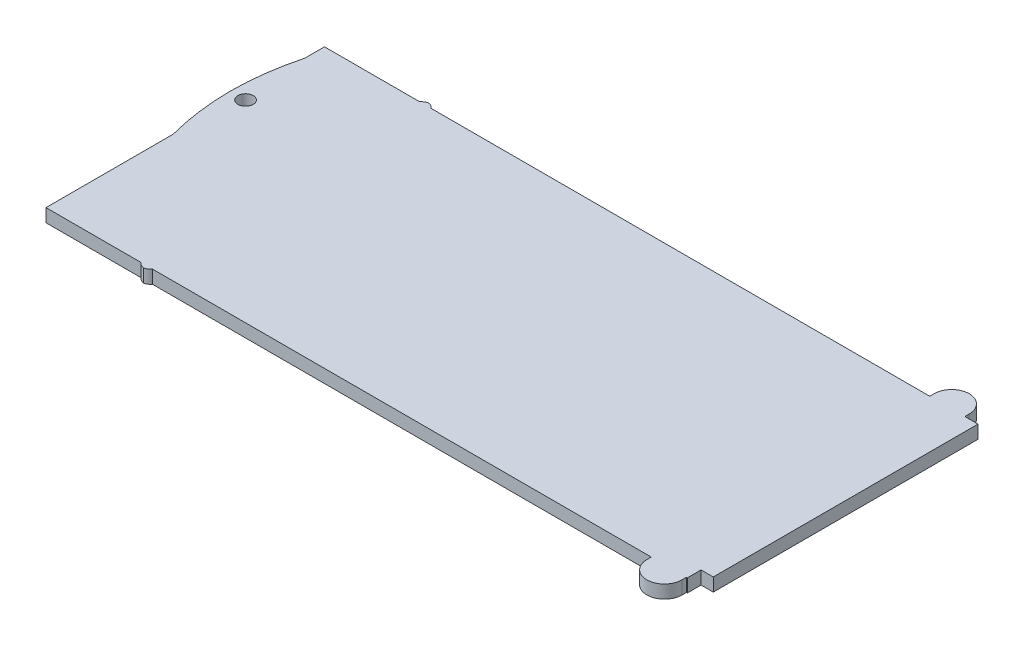
ISO-10303-21;
HEADER;
FILE_DESCRIPTION(('STEP AP214'),'2;1');
FILE_NAME('part.step','',(''),(''),'','','');
FILE_SCHEMA(('AUTOMOTIVE_DESIGN { 1 0 10303 214 1 1 1 1 }'));
ENDSEC;
DATA;
#1=APPLICATION_CONTEXT('core data for automotive mechanical design processes');
#2=APPLICATION_PROTOCOL_DEFINITION('international standard','automotive_design',2000,#1);
#3=PRODUCT_CONTEXT('',#1,'mechanical');
#4=PRODUCT('Part','Part','',(#3));
#5=PRODUCT_RELATED_PRODUCT_CATEGORY('part','',(#4));
#6=PRODUCT_DEFINITION_FORMATION('','',#4);
#7=PRODUCT_DEFINITION_CONTEXT('part definition',#1,'design');
#8=PRODUCT_DEFINITION('design','',#6,#7);
#9=PRODUCT_DEFINITION_SHAPE('','',#8);
#10=(LENGTH_UNIT() NAMED_UNIT(*) SI_UNIT(.MILLI.,.METRE.));
#11=(NAMED_UNIT(*) PLANE_ANGLE_UNIT() SI_UNIT($,.RADIAN.));
#12=(NAMED_UNIT(*) SI_UNIT($,.STERADIAN.) SOLID_ANGLE_UNIT());
#13=UNCERTAINTY_MEASURE_WITH_UNIT(LENGTH_MEASURE(1.E-05),#10,'distance_accuracy_value','');
#14=(GEOMETRIC_REPRESENTATION_CONTEXT(3) GLOBAL_UNCERTAINTY_ASSIGNED_CONTEXT((#13)) GLOBAL_UNIT_ASSIGNED_CONTEXT((#10,
#11,#12)) REPRESENTATION_CONTEXT('',''));
#15=CARTESIAN_POINT('',(0.,0.,0.));
#16=DIRECTION('',(0.,0.,1.));
#17=DIRECTION('',(1.,0.,0.));
#18=AXIS2_PLACEMENT_3D('',#15,#16,#17);
#19=CARTESIAN_POINT('',(55.796483334157,3.,78.70000006647));
#20=DIRECTION('',(0.,1.,0.));
#21=DIRECTION('',(0.,0.,1.));
#22=AXIS2_PLACEMENT_3D('',#19,#20,#21);
#23=PLANE('',#22);
#24=DIRECTION('',(0.,0.,1.));
#25=VECTOR('',#24,1.);
#26=CARTESIAN_POINT('',(32.5000000274549,3.,82.0000000692838));
#27=LINE('',#26,#25);
#28=CARTESIAN_POINT('',(32.5000000274549,3.,77.5000000654817));
#29=VERTEX_POINT('',#28);
#30=CARTESIAN_POINT('',(32.5000000274549,3.,82.0000000692838));
#31=VERTEX_POINT('',#30);
#32=EDGE_CURVE('E268',#29,#31,#27,.T.);
#33=ORIENTED_EDGE('',*,*,#32,.T.);
#34=CARTESIAN_POINT('',(90.5000000764622,3.,97.3622915780042));
#35=DIRECTION('',(0.,1.,0.));
#36=DIRECTION('',(0.,0.,1.));
#37=AXIS2_PLACEMENT_3D('',#34,#35,#36);
#38=CIRCLE('',#37,60.0000000506978);
#39=CARTESIAN_POINT('',(30.5010938284658,3.,97.0000000822646));
#40=VERTEX_POINT('',#39);
#41=EDGE_CURVE('E141',#31,#40,#38,.T.);
#42=ORIENTED_EDGE('',*,*,#41,.T.);
#43=CARTESIAN_POINT('',(90.5000000764559,3.,96.6377085856338));
#44=DIRECTION('',(0.,1.,0.));
#45=DIRECTION('',(0.,0.,1.));
#46=AXIS2_PLACEMENT_3D('',#43,#44,#45);
#47=CIRCLE('',#46,60.000000050697);
#48=CARTESIAN_POINT('',(32.5000000274601,3.,112.000000094394));
#49=VERTEX_POINT('',#48);
#50=EDGE_CURVE('E328',#40,#49,#47,.T.);
#51=ORIENTED_EDGE('',*,*,#50,.T.);
#52=DIRECTION('',(0.,0.,1.));
#53=VECTOR('',#52,1.);
#54=CARTESIAN_POINT('',(32.5000000274601,3.,141.000000119134));
#55=LINE('',#54,#53);
#56=CARTESIAN_POINT('',(32.5000000274601,3.,141.000000119134));
#57=VERTEX_POINT('',#56);
#58=EDGE_CURVE('E347',#49,#57,#55,.T.);
#59=ORIENTED_EDGE('',*,*,#58,.T.);
#60=DIRECTION('',(1.,0.,0.));
#61=VECTOR('',#60,1.);
#62=CARTESIAN_POINT('',(54.196483332792,3.,141.000000119134));
#63=LINE('',#62,#61);
#64=CARTESIAN_POINT('',(54.196483332792,3.,141.000000119134));
#65=VERTEX_POINT('',#64);
#66=EDGE_CURVE('E344',#57,#65,#63,.T.);
#67=ORIENTED_EDGE('',*,*,#66,.T.);
#68=CARTESIAN_POINT('',(55.7964833341438,3.,139.800000118121));
#69=DIRECTION('',(0.,1.,0.));
#70=DIRECTION('',(0.,0.,1.));
#71=AXIS2_PLACEMENT_3D('',#68,#69,#70);
#72=CIRCLE('',#71,2.00000000168975);
#73=CARTESIAN_POINT('',(55.4969606139618,3.,141.777444465467));
#74=VERTEX_POINT('',#73);
#75=EDGE_CURVE('E346',#65,#74,#72,.T.);
#76=ORIENTED_EDGE('',*,*,#75,.T.);
#77=CARTESIAN_POINT('',(55.1974378936196,3.,139.800000118145));
#78=DIRECTION('',(0.,1.,0.));
#79=DIRECTION('',(0.,0.,1.));
#80=AXIS2_PLACEMENT_3D('',#77,#78,#79);
#81=CIRCLE('',#80,2.00000000168986);
#82=CARTESIAN_POINT('',(56.7974378949905,3.,141.000000119133));
#83=VERTEX_POINT('',#82);
#84=EDGE_CURVE('E349',#74,#83,#81,.T.);
#85=ORIENTED_EDGE('',*,*,#84,.T.);
#86=DIRECTION('',(1.,0.,0.));
#87=VECTOR('',#86,1.);
#88=CARTESIAN_POINT('',(170.50000014406,3.,141.000000119134));
#89=LINE('',#88,#87);
#90=CARTESIAN_POINT('',(170.50000014406,3.,141.000000119134));
#91=VERTEX_POINT('',#90);
#92=EDGE_CURVE('E355',#83,#91,#89,.T.);
#93=ORIENTED_EDGE('',*,*,#92,.T.);
#94=DIRECTION('',(0.,0.,1.));
#95=VECTOR('',#94,1.);
#96=CARTESIAN_POINT('',(170.50000014406,3.,142.000000119979));
#97=LINE('',#96,#95);
#98=CARTESIAN_POINT('',(170.50000014406,3.,142.000000119979));
#99=VERTEX_POINT('',#98);
#100=EDGE_CURVE('E357',#91,#99,#97,.T.);
#101=ORIENTED_EDGE('',*,*,#100,.T.);
#102=CARTESIAN_POINT('',(174.500000147439,3.,142.000000119979));
#103=DIRECTION('',(0.,1.,0.));
#104=DIRECTION('',(0.,0.,1.));
#105=AXIS2_PLACEMENT_3D('',#102,#103,#104);
#106=CIRCLE('',#105,4.00000000337969);
#107=CARTESIAN_POINT('',(178.500000150819,3.,142.000000119979));
#108=VERTEX_POINT('',#107);
#109=EDGE_CURVE('E359',#99,#108,#106,.T.);
#110=ORIENTED_EDGE('',*,*,#109,.T.);
#111=DIRECTION('',(0.,0.,-1.));
#112=VECTOR('',#111,1.);
#113=CARTESIAN_POINT('',(178.500000150819,3.,142.000000119979));
#114=LINE('',#113,#112);
#115=CARTESIAN_POINT('',(178.500000150819,3.,141.000000119134));
#116=VERTEX_POINT('',#115);
#117=EDGE_CURVE('E361',#108,#116,#114,.T.);
#118=ORIENTED_EDGE('',*,*,#117,.T.);
#119=DIRECTION('',(1.,0.,0.));
#120=VECTOR('',#119,1.);
#121=CARTESIAN_POINT('',(178.718053625003,3.,141.000000119134));
#122=LINE('',#121,#120);
#123=CARTESIAN_POINT('',(178.718053625003,3.,141.000000119134));
#124=VERTEX_POINT('',#123);
#125=EDGE_CURVE('E363',#116,#124,#122,.T.);
#126=ORIENTED_EDGE('',*,*,#125,.T.);
#127=DIRECTION('',(0.,0.,-1.));
#128=VECTOR('',#127,1.);
#129=CARTESIAN_POINT('',(178.718053625003,3.,141.000000119134));
#130=LINE('',#129,#128);
#131=CARTESIAN_POINT('',(178.718053625003,3.,137.860356365482));
#132=VERTEX_POINT('',#131);
#133=EDGE_CURVE('E365',#124,#132,#130,.T.);
#134=ORIENTED_EDGE('',*,*,#133,.T.);
#135=DIRECTION('',(1.,0.,-4.58943572534551E-13));
#136=VECTOR('',#135,1.);
#137=CARTESIAN_POINT('',(178.718053625003,3.,137.860356365482));
#138=LINE('',#137,#136);
#139=CARTESIAN_POINT('',(181.500000153349,3.,137.86035636548));
#140=VERTEX_POINT('',#139);
#141=EDGE_CURVE('E367',#132,#140,#138,.T.);
#142=ORIENTED_EDGE('',*,*,#141,.T.);
#143=DIRECTION('',(0.,0.,-1.));
#144=VECTOR('',#143,1.);
#145=CARTESIAN_POINT('',(181.500000153349,3.,77.5000000654804));
#146=LINE('',#145,#144);
#147=CARTESIAN_POINT('',(181.500000153349,3.,77.5000000654804));
#148=VERTEX_POINT('',#147);
#149=EDGE_CURVE('E369',#140,#148,#146,.T.);
#150=ORIENTED_EDGE('',*,*,#149,.T.);
#151=DIRECTION('',(-1.,0.,0.));
#152=VECTOR('',#151,1.);
#153=CARTESIAN_POINT('',(178.500000150814,3.,77.5000000654804));
#154=LINE('',#153,#152);
#155=CARTESIAN_POINT('',(178.500000150814,3.,77.5000000654804));
#156=VERTEX_POINT('',#155);
#157=EDGE_CURVE('E371',#148,#156,#154,.T.);
#158=ORIENTED_EDGE('',*,*,#157,.T.);
#159=DIRECTION('',(0.,0.,-1.));
#160=VECTOR('',#159,1.);
#161=CARTESIAN_POINT('',(178.500000150814,3.,76.5000000646355));
#162=LINE('',#161,#160);
#163=CARTESIAN_POINT('',(178.500000150814,3.,76.5000000646355));
#164=VERTEX_POINT('',#163);
#165=EDGE_CURVE('E373',#156,#164,#162,.T.);
#166=ORIENTED_EDGE('',*,*,#165,.T.);
#167=CARTESIAN_POINT('',(174.500000147434,3.,76.5000000646355));
#168=DIRECTION('',(0.,1.,0.));
#169=DIRECTION('',(0.,0.,1.));
#170=AXIS2_PLACEMENT_3D('',#167,#168,#169);
#171=CIRCLE('',#170,4.00000000337969);
#172=CARTESIAN_POINT('',(170.500000144055,3.,76.5000000646355));
#173=VERTEX_POINT('',#172);
#174=EDGE_CURVE('E375',#164,#173,#171,.T.);
#175=ORIENTED_EDGE('',*,*,#174,.T.);
#176=DIRECTION('',(0.,0.,1.));
#177=VECTOR('',#176,1.);
#178=CARTESIAN_POINT('',(170.500000144055,3.,76.5000000646355));
#179=LINE('',#178,#177);
#180=CARTESIAN_POINT('',(170.500000144055,3.,77.5000000654804));
#181=VERTEX_POINT('',#180);
#182=EDGE_CURVE('E377',#173,#181,#179,.T.);
#183=ORIENTED_EDGE('',*,*,#182,.T.);
#184=DIRECTION('',(-1.,0.,0.));
#185=VECTOR('',#184,1.);
#186=CARTESIAN_POINT('',(56.7974378949845,3.,77.5000000654804));
#187=LINE('',#186,#185);
#188=CARTESIAN_POINT('',(56.7974378949845,3.,77.5000000654804));
#189=VERTEX_POINT('',#188);
#190=EDGE_CURVE('E205',#181,#189,#187,.T.);
#191=ORIENTED_EDGE('',*,*,#190,.T.);
#192=CARTESIAN_POINT('',(55.1974378936326,3.,78.7000000664943));
#193=DIRECTION('',(0.,1.,0.));
#194=DIRECTION('',(0.,0.,1.));
#195=AXIS2_PLACEMENT_3D('',#192,#193,#194);
#196=CIRCLE('',#195,2.00000000168988);
#197=CARTESIAN_POINT('',(55.4969606138146,3.,76.7225557191474));
#198=VERTEX_POINT('',#197);
#199=EDGE_CURVE('E199',#189,#198,#196,.T.);
#200=ORIENTED_EDGE('',*,*,#199,.T.);
#201=CARTESIAN_POINT('',(55.796483334157,3.,78.70000006647));
#202=DIRECTION('',(0.,1.,0.));
#203=DIRECTION('',(0.,0.,1.));
#204=AXIS2_PLACEMENT_3D('',#201,#202,#203);
#205=CIRCLE('',#204,2.00000000168979);
#206=CARTESIAN_POINT('',(54.1964833327859,3.,77.5000000654817));
#207=VERTEX_POINT('',#206);
#208=EDGE_CURVE('E203',#198,#207,#205,.T.);
#209=ORIENTED_EDGE('',*,*,#208,.T.);
#210=DIRECTION('',(-1.,0.,0.));
#211=VECTOR('',#210,1.);
#212=CARTESIAN_POINT('',(32.5000000274549,3.,77.5000000654817));
#213=LINE('',#212,#211);
#214=EDGE_CURVE('E53',#207,#29,#213,.T.);
#215=ORIENTED_EDGE('',*,*,#214,.T.);
#216=EDGE_LOOP('',(#33,#42,#51,#59,#67,#76,#85,#93,#101,#110,#118,#126,#134,#142,#150,#158,#166,
#175,#183,#191,#200,#209,#215));
#217=FACE_BOUND('',#216,.T.);
#218=CARTESIAN_POINT('',(34.0000000287274,3.,97.0000000819577));
#219=DIRECTION('',(0.,1.,0.));
#220=DIRECTION('',(0.,0.,1.));
#221=AXIS2_PLACEMENT_3D('',#218,#219,#220);
#222=CIRCLE('',#221,1.75000000147862);
#223=CARTESIAN_POINT('',(34.0000000287274,3.,98.7500000834364));
#224=VERTEX_POINT('',#223);
#225=EDGE_CURVE('E227',#224,#224,#222,.T.);
#226=ORIENTED_EDGE('',*,*,#225,.F.);
#227=EDGE_LOOP('',(#226));
#228=FACE_BOUND('',#227,.T.);
#229=ADVANCED_FACE('F36',(#217,#228),#23,.T.);
#230=CARTESIAN_POINT('',(55.796483334157,0.,78.70000006647));
#231=DIRECTION('',(0.,1.,0.));
#232=DIRECTION('',(0.,0.,1.));
#233=AXIS2_PLACEMENT_3D('',#230,#231,#232);
#234=PLANE('',#233);
#235=DIRECTION('',(0.,0.,1.));
#236=VECTOR('',#235,1.);
#237=CARTESIAN_POINT('',(32.5000000274549,0.,82.0000000692838));
#238=LINE('',#237,#236);
#239=CARTESIAN_POINT('',(32.5000000274549,0.,77.5000000654817));
#240=VERTEX_POINT('',#239);
#241=CARTESIAN_POINT('',(32.5000000274549,0.,82.0000000692838));
#242=VERTEX_POINT('',#241);
#243=EDGE_CURVE('E223',#240,#242,#238,.T.);
#244=ORIENTED_EDGE('',*,*,#243,.F.);
#245=DIRECTION('',(-1.,0.,0.));
#246=VECTOR('',#245,1.);
#247=CARTESIAN_POINT('',(32.5000000274549,0.,77.5000000654817));
#248=LINE('',#247,#246);
#249=CARTESIAN_POINT('',(54.1964833327859,0.,77.5000000654817));
#250=VERTEX_POINT('',#249);
#251=EDGE_CURVE('E133',#250,#240,#248,.T.);
#252=ORIENTED_EDGE('',*,*,#251,.F.);
#253=CARTESIAN_POINT('',(55.796483334157,0.,78.70000006647));
#254=DIRECTION('',(0.,1.,0.));
#255=DIRECTION('',(0.,0.,1.));
#256=AXIS2_PLACEMENT_3D('',#253,#254,#255);
#257=CIRCLE('',#256,2.00000000168979);
#258=CARTESIAN_POINT('',(55.4969606138146,0.,76.7225557191474));
#259=VERTEX_POINT('',#258);
#260=EDGE_CURVE('E127',#259,#250,#257,.T.);
#261=ORIENTED_EDGE('',*,*,#260,.F.);
#262=CARTESIAN_POINT('',(55.1974378936326,0.,78.7000000664943));
#263=DIRECTION('',(0.,1.,0.));
#264=DIRECTION('',(0.,0.,1.));
#265=AXIS2_PLACEMENT_3D('',#262,#263,#264);
#266=CIRCLE('',#265,2.00000000168988);
#267=CARTESIAN_POINT('',(56.7974378949845,0.,77.5000000654804));
#268=VERTEX_POINT('',#267);
#269=EDGE_CURVE('E213',#268,#259,#266,.T.);
#270=ORIENTED_EDGE('',*,*,#269,.F.);
#271=DIRECTION('',(-1.,0.,0.));
#272=VECTOR('',#271,1.);
#273=CARTESIAN_POINT('',(56.7974378949845,0.,77.5000000654804));
#274=LINE('',#273,#272);
#275=CARTESIAN_POINT('',(170.500000144055,0.,77.5000000654804));
#276=VERTEX_POINT('',#275);
#277=EDGE_CURVE('E263',#276,#268,#274,.T.);
#278=ORIENTED_EDGE('',*,*,#277,.F.);
#279=DIRECTION('',(0.,0.,1.));
#280=VECTOR('',#279,1.);
#281=CARTESIAN_POINT('',(170.500000144055,0.,76.5000000646355));
#282=LINE('',#281,#280);
#283=CARTESIAN_POINT('',(170.500000144055,0.,76.5000000646355));
#284=VERTEX_POINT('',#283);
#285=EDGE_CURVE('E261',#284,#276,#282,.T.);
#286=ORIENTED_EDGE('',*,*,#285,.F.);
#287=CARTESIAN_POINT('',(174.500000147434,0.,76.5000000646355));
#288=DIRECTION('',(0.,1.,0.));
#289=DIRECTION('',(0.,0.,1.));
#290=AXIS2_PLACEMENT_3D('',#287,#288,#289);
#291=CIRCLE('',#290,4.00000000337969);
#292=CARTESIAN_POINT('',(178.500000150814,0.,76.5000000646355));
#293=VERTEX_POINT('',#292);
#294=EDGE_CURVE('E259',#293,#284,#291,.T.);
#295=ORIENTED_EDGE('',*,*,#294,.F.);
#296=DIRECTION('',(0.,0.,-1.));
#297=VECTOR('',#296,1.);
#298=CARTESIAN_POINT('',(178.500000150814,0.,76.5000000646355));
#299=LINE('',#298,#297);
#300=CARTESIAN_POINT('',(178.500000150814,0.,77.5000000654804));
#301=VERTEX_POINT('',#300);
#302=EDGE_CURVE('E257',#301,#293,#299,.T.);
#303=ORIENTED_EDGE('',*,*,#302,.F.);
#304=DIRECTION('',(-1.,0.,0.));
#305=VECTOR('',#304,1.);
#306=CARTESIAN_POINT('',(178.500000150814,0.,77.5000000654804));
#307=LINE('',#306,#305);
#308=CARTESIAN_POINT('',(181.500000153349,0.,77.5000000654804));
#309=VERTEX_POINT('',#308);
#310=EDGE_CURVE('E255',#309,#301,#307,.T.);
#311=ORIENTED_EDGE('',*,*,#310,.F.);
#312=DIRECTION('',(0.,0.,-1.));
#313=VECTOR('',#312,1.);
#314=CARTESIAN_POINT('',(181.500000153349,0.,77.5000000654804));
#315=LINE('',#314,#313);
#316=CARTESIAN_POINT('',(181.500000153349,0.,137.86035636548));
#317=VERTEX_POINT('',#316);
#318=EDGE_CURVE('E253',#317,#309,#315,.T.);
#319=ORIENTED_EDGE('',*,*,#318,.F.);
#320=DIRECTION('',(1.,0.,-4.58943572534551E-13));
#321=VECTOR('',#320,1.);
#322=CARTESIAN_POINT('',(178.718053625003,0.,137.860356365482));
#323=LINE('',#322,#321);
#324=CARTESIAN_POINT('',(178.718053625003,0.,137.860356365482));
#325=VERTEX_POINT('',#324);
#326=EDGE_CURVE('E251',#325,#317,#323,.T.);
#327=ORIENTED_EDGE('',*,*,#326,.F.);
#328=DIRECTION('',(0.,0.,-1.));
#329=VECTOR('',#328,1.);
#330=CARTESIAN_POINT('',(178.718053625003,0.,141.000000119134));
#331=LINE('',#330,#329);
#332=CARTESIAN_POINT('',(178.718053625003,0.,141.000000119134));
#333=VERTEX_POINT('',#332);
#334=EDGE_CURVE('E249',#333,#325,#331,.T.);
#335=ORIENTED_EDGE('',*,*,#334,.F.);
#336=DIRECTION('',(1.,0.,0.));
#337=VECTOR('',#336,1.);
#338=CARTESIAN_POINT('',(178.718053625003,0.,141.000000119134));
#339=LINE('',#338,#337);
#340=CARTESIAN_POINT('',(178.500000150819,0.,141.000000119134));
#341=VERTEX_POINT('',#340);
#342=EDGE_CURVE('E247',#341,#333,#339,.T.);
#343=ORIENTED_EDGE('',*,*,#342,.F.);
#344=DIRECTION('',(0.,0.,-1.));
#345=VECTOR('',#344,1.);
#346=CARTESIAN_POINT('',(178.500000150819,0.,142.000000119979));
#347=LINE('',#346,#345);
#348=CARTESIAN_POINT('',(178.500000150819,0.,142.000000119979));
#349=VERTEX_POINT('',#348);
#350=EDGE_CURVE('E245',#349,#341,#347,.T.);
#351=ORIENTED_EDGE('',*,*,#350,.F.);
#352=CARTESIAN_POINT('',(174.500000147439,0.,142.000000119979));
#353=DIRECTION('',(0.,1.,0.));
#354=DIRECTION('',(0.,0.,1.));
#355=AXIS2_PLACEMENT_3D('',#352,#353,#354);
#356=CIRCLE('',#355,4.00000000337969);
#357=CARTESIAN_POINT('',(170.50000014406,0.,142.000000119979));
#358=VERTEX_POINT('',#357);
#359=EDGE_CURVE('E243',#358,#349,#356,.T.);
#360=ORIENTED_EDGE('',*,*,#359,.F.);
#361=DIRECTION('',(0.,0.,1.));
#362=VECTOR('',#361,1.);
#363=CARTESIAN_POINT('',(170.50000014406,0.,142.000000119979));
#364=LINE('',#363,#362);
#365=CARTESIAN_POINT('',(170.50000014406,0.,141.000000119134));
#366=VERTEX_POINT('',#365);
#367=EDGE_CURVE('E241',#366,#358,#364,.T.);
#368=ORIENTED_EDGE('',*,*,#367,.F.);
#369=DIRECTION('',(1.,0.,0.));
#370=VECTOR('',#369,1.);
#371=CARTESIAN_POINT('',(170.50000014406,0.,141.000000119134));
#372=LINE('',#371,#370);
#373=CARTESIAN_POINT('',(56.7974378949905,0.,141.000000119133));
#374=VERTEX_POINT('',#373);
#375=EDGE_CURVE('E239',#374,#366,#372,.T.);
#376=ORIENTED_EDGE('',*,*,#375,.F.);
#377=CARTESIAN_POINT('',(55.1974378936196,0.,139.800000118145));
#378=DIRECTION('',(0.,1.,0.));
#379=DIRECTION('',(0.,0.,1.));
#380=AXIS2_PLACEMENT_3D('',#377,#378,#379);
#381=CIRCLE('',#380,2.00000000168986);
#382=CARTESIAN_POINT('',(55.4969606139618,0.,141.777444465467));
#383=VERTEX_POINT('',#382);
#384=EDGE_CURVE('E237',#383,#374,#381,.T.);
#385=ORIENTED_EDGE('',*,*,#384,.F.);
#386=CARTESIAN_POINT('',(55.7964833341438,0.,139.800000118121));
#387=DIRECTION('',(0.,1.,0.));
#388=DIRECTION('',(0.,0.,1.));
#389=AXIS2_PLACEMENT_3D('',#386,#387,#388);
#390=CIRCLE('',#389,2.00000000168975);
#391=CARTESIAN_POINT('',(54.196483332792,0.,141.000000119134));
#392=VERTEX_POINT('',#391);
#393=EDGE_CURVE('E235',#392,#383,#390,.T.);
#394=ORIENTED_EDGE('',*,*,#393,.F.);
#395=DIRECTION('',(1.,0.,0.));
#396=VECTOR('',#395,1.);
#397=CARTESIAN_POINT('',(54.196483332792,0.,141.000000119134));
#398=LINE('',#397,#396);
#399=CARTESIAN_POINT('',(32.5000000274601,0.,141.000000119134));
#400=VERTEX_POINT('',#399);
#401=EDGE_CURVE('E233',#400,#392,#398,.T.);
#402=ORIENTED_EDGE('',*,*,#401,.F.);
#403=DIRECTION('',(0.,0.,1.));
#404=VECTOR('',#403,1.);
#405=CARTESIAN_POINT('',(32.5000000274601,0.,141.000000119134));
#406=LINE('',#405,#404);
#407=CARTESIAN_POINT('',(32.5000000274601,0.,112.000000094394));
#408=VERTEX_POINT('',#407);
#409=EDGE_CURVE('E231',#408,#400,#406,.T.);
#410=ORIENTED_EDGE('',*,*,#409,.F.);
#411=CARTESIAN_POINT('',(90.5000000764559,0.,96.6377085856338));
#412=DIRECTION('',(0.,1.,0.));
#413=DIRECTION('',(0.,0.,1.));
#414=AXIS2_PLACEMENT_3D('',#411,#412,#413);
#415=CIRCLE('',#414,60.000000050697);
#416=CARTESIAN_POINT('',(30.5010938284658,0.,97.0000000822646));
#417=VERTEX_POINT('',#416);
#418=EDGE_CURVE('E229',#417,#408,#415,.T.);
#419=ORIENTED_EDGE('',*,*,#418,.F.);
#420=CARTESIAN_POINT('',(90.5000000764622,0.,97.3622915780042));
#421=DIRECTION('',(0.,1.,0.));
#422=DIRECTION('',(0.,0.,1.));
#423=AXIS2_PLACEMENT_3D('',#420,#421,#422);
#424=CIRCLE('',#423,60.0000000506978);
#425=EDGE_CURVE('E226',#242,#417,#424,.T.);
#426=ORIENTED_EDGE('',*,*,#425,.F.);
#427=EDGE_LOOP('',(#244,#252,#261,#270,#278,#286,#295,#303,#311,#319,#327,#335,#343,#351,#360,
#368,#376,#385,#394,#402,#410,#419,#426));
#428=FACE_BOUND('',#427,.T.);
#429=CARTESIAN_POINT('',(34.0000000287274,0.,97.0000000819577));
#430=DIRECTION('',(0.,1.,0.));
#431=DIRECTION('',(0.,0.,1.));
#432=AXIS2_PLACEMENT_3D('',#429,#430,#431);
#433=CIRCLE('',#432,1.75000000147862);
#434=CARTESIAN_POINT('',(34.0000000287274,0.,98.7500000834364));
#435=VERTEX_POINT('',#434);
#436=EDGE_CURVE('E667',#435,#435,#433,.T.);
#437=ORIENTED_EDGE('',*,*,#436,.T.);
#438=EDGE_LOOP('',(#437));
#439=FACE_BOUND('',#438,.T.);
#440=ADVANCED_FACE('F332',(#428,#439),#234,.F.);
#441=CARTESIAN_POINT('',(32.5000000274549,3.,82.0000000692838));
#442=DIRECTION('',(1.,0.,0.));
#443=DIRECTION('',(0.,0.,-1.));
#444=AXIS2_PLACEMENT_3D('',#441,#442,#443);
#445=PLANE('',#444);
#446=ORIENTED_EDGE('',*,*,#243,.T.);
#447=DIRECTION('',(0.,-1.,0.));
#448=VECTOR('',#447,1.);
#449=CARTESIAN_POINT('',(32.5000000274549,3.,82.0000000692838));
#450=LINE('',#449,#448);
#451=EDGE_CURVE('E11',#31,#242,#450,.T.);
#452=ORIENTED_EDGE('',*,*,#451,.F.);
#453=ORIENTED_EDGE('',*,*,#32,.F.);
#454=DIRECTION('',(0.,-1.,0.));
#455=VECTOR('',#454,1.);
#456=CARTESIAN_POINT('',(32.5000000274549,3.,77.5000000654817));
#457=LINE('',#456,#455);
#458=EDGE_CURVE('E219',#29,#240,#457,.T.);
#459=ORIENTED_EDGE('',*,*,#458,.T.);
#460=EDGE_LOOP('',(#446,#452,#453,#459));
#461=FACE_BOUND('',#460,.T.);
#462=ADVANCED_FACE('F38',(#461),#445,.F.);
#463=CARTESIAN_POINT('',(90.5000000764622,3.,97.3622915780042));
#464=DIRECTION('',(0.,-1.,0.));
#465=DIRECTION('',(0.,0.,-1.));
#466=AXIS2_PLACEMENT_3D('',#463,#464,#465);
#467=CYLINDRICAL_SURFACE('',#466,60.0000000506978);
#468=ORIENTED_EDGE('',*,*,#425,.T.);
#469=DIRECTION('',(0.,-1.,0.));
#470=VECTOR('',#469,1.);
#471=CARTESIAN_POINT('',(30.5010938284658,3.,97.0000000822646));
#472=LINE('',#471,#470);
#473=EDGE_CURVE('E45',#40,#417,#472,.T.);
#474=ORIENTED_EDGE('',*,*,#473,.F.);
#475=ORIENTED_EDGE('',*,*,#41,.F.);
#476=ORIENTED_EDGE('',*,*,#451,.T.);
#477=EDGE_LOOP('',(#468,#474,#475,#476));
#478=FACE_BOUND('',#477,.T.);
#479=ADVANCED_FACE('F411',(#478),#467,.T.);
#480=CARTESIAN_POINT('',(90.5000000764559,3.,96.6377085856338));
#481=DIRECTION('',(0.,-1.,0.));
#482=DIRECTION('',(0.,0.,-1.));
#483=AXIS2_PLACEMENT_3D('',#480,#481,#482);
#484=CYLINDRICAL_SURFACE('',#483,60.000000050697);
#485=ORIENTED_EDGE('',*,*,#418,.T.);
#486=DIRECTION('',(0.,-1.,0.));
#487=VECTOR('',#486,1.);
#488=CARTESIAN_POINT('',(32.5000000274601,3.,112.000000094394));
#489=LINE('',#488,#487);
#490=EDGE_CURVE('E320',#49,#408,#489,.T.);
#491=ORIENTED_EDGE('',*,*,#490,.F.);
#492=ORIENTED_EDGE('',*,*,#50,.F.);
#493=ORIENTED_EDGE('',*,*,#473,.T.);
#494=EDGE_LOOP('',(#485,#491,#492,#493));
#495=FACE_BOUND('',#494,.T.);
#496=ADVANCED_FACE('F326',(#495),#484,.T.);
#497=CARTESIAN_POINT('',(32.5000000274601,3.,141.000000119134));
#498=DIRECTION('',(1.,0.,0.));
#499=DIRECTION('',(0.,0.,-1.));
#500=AXIS2_PLACEMENT_3D('',#497,#498,#499);
#501=PLANE('',#500);
#502=ORIENTED_EDGE('',*,*,#409,.T.);
#503=DIRECTION('',(0.,-1.,0.));
#504=VECTOR('',#503,1.);
#505=CARTESIAN_POINT('',(32.5000000274601,3.,141.000000119134));
#506=LINE('',#505,#504);
#507=EDGE_CURVE('E317',#57,#400,#506,.T.);
#508=ORIENTED_EDGE('',*,*,#507,.F.);
#509=ORIENTED_EDGE('',*,*,#58,.F.);
#510=ORIENTED_EDGE('',*,*,#490,.T.);
#511=EDGE_LOOP('',(#502,#508,#509,#510));
#512=FACE_BOUND('',#511,.T.);
#513=ADVANCED_FACE('F338',(#512),#501,.F.);
#514=CARTESIAN_POINT('',(54.196483332792,3.,141.000000119134));
#515=DIRECTION('',(0.,0.,-1.));
#516=DIRECTION('',(-1.,0.,0.));
#517=AXIS2_PLACEMENT_3D('',#514,#515,#516);
#518=PLANE('',#517);
#519=ORIENTED_EDGE('',*,*,#401,.T.);
#520=DIRECTION('',(0.,-1.,0.));
#521=VECTOR('',#520,1.);
#522=CARTESIAN_POINT('',(54.196483332792,3.,141.000000119134));
#523=LINE('',#522,#521);
#524=EDGE_CURVE('E314',#65,#392,#523,.T.);
#525=ORIENTED_EDGE('',*,*,#524,.F.);
#526=ORIENTED_EDGE('',*,*,#66,.F.);
#527=ORIENTED_EDGE('',*,*,#507,.T.);
#528=EDGE_LOOP('',(#519,#525,#526,#527));
#529=FACE_BOUND('',#528,.T.);
#530=ADVANCED_FACE('F342',(#529),#518,.F.);
#531=CARTESIAN_POINT('',(55.7964833341438,3.,139.800000118121));
#532=DIRECTION('',(0.,-1.,0.));
#533=DIRECTION('',(0.,0.,-1.));
#534=AXIS2_PLACEMENT_3D('',#531,#532,#533);
#535=CYLINDRICAL_SURFACE('',#534,2.00000000168975);
#536=ORIENTED_EDGE('',*,*,#393,.T.);
#537=DIRECTION('',(0.,-1.,0.));
#538=VECTOR('',#537,1.);
#539=CARTESIAN_POINT('',(55.4969606139618,3.,141.777444465467));
#540=LINE('',#539,#538);
#541=EDGE_CURVE('E311',#74,#383,#540,.T.);
#542=ORIENTED_EDGE('',*,*,#541,.F.);
#543=ORIENTED_EDGE('',*,*,#75,.F.);
#544=ORIENTED_EDGE('',*,*,#524,.T.);
#545=EDGE_LOOP('',(#536,#542,#543,#544));
#546=FACE_BOUND('',#545,.T.);
#547=ADVANCED_FACE('F424',(#546),#535,.T.);
#548=CARTESIAN_POINT('',(55.1974378936196,3.,139.800000118145));
#549=DIRECTION('',(0.,-1.,0.));
#550=DIRECTION('',(0.,0.,-1.));
#551=AXIS2_PLACEMENT_3D('',#548,#549,#550);
#552=CYLINDRICAL_SURFACE('',#551,2.00000000168986);
#553=ORIENTED_EDGE('',*,*,#384,.T.);
#554=DIRECTION('',(0.,-1.,0.));
#555=VECTOR('',#554,1.);
#556=CARTESIAN_POINT('',(56.7974378949905,3.,141.000000119133));
#557=LINE('',#556,#555);
#558=EDGE_CURVE('E308',#83,#374,#557,.T.);
#559=ORIENTED_EDGE('',*,*,#558,.F.);
#560=ORIENTED_EDGE('',*,*,#84,.F.);
#561=ORIENTED_EDGE('',*,*,#541,.T.);
#562=EDGE_LOOP('',(#553,#559,#560,#561));
#563=FACE_BOUND('',#562,.T.);
#564=ADVANCED_FACE('F427',(#563),#552,.T.);
#565=CARTESIAN_POINT('',(170.50000014406,3.,141.000000119134));
#566=DIRECTION('',(0.,0.,-1.));
#567=DIRECTION('',(-1.,0.,0.));
#568=AXIS2_PLACEMENT_3D('',#565,#566,#567);
#569=PLANE('',#568);
#570=ORIENTED_EDGE('',*,*,#375,.T.);
#571=DIRECTION('',(0.,-1.,0.));
#572=VECTOR('',#571,1.);
#573=CARTESIAN_POINT('',(170.50000014406,3.,141.000000119134));
#574=LINE('',#573,#572);
#575=EDGE_CURVE('E305',#91,#366,#574,.T.);
#576=ORIENTED_EDGE('',*,*,#575,.F.);
#577=ORIENTED_EDGE('',*,*,#92,.F.);
#578=ORIENTED_EDGE('',*,*,#558,.T.);
#579=EDGE_LOOP('',(#570,#576,#577,#578));
#580=FACE_BOUND('',#579,.T.);
#581=ADVANCED_FACE('F431',(#580),#569,.F.);
#582=CARTESIAN_POINT('',(170.50000014406,3.,142.000000119979));
#583=DIRECTION('',(1.,0.,0.));
#584=DIRECTION('',(0.,0.,-1.));
#585=AXIS2_PLACEMENT_3D('',#582,#583,#584);
#586=PLANE('',#585);
#587=ORIENTED_EDGE('',*,*,#367,.T.);
#588=DIRECTION('',(0.,-1.,0.));
#589=VECTOR('',#588,1.);
#590=CARTESIAN_POINT('',(170.50000014406,3.,142.000000119979));
#591=LINE('',#590,#589);
#592=EDGE_CURVE('E302',#99,#358,#591,.T.);
#593=ORIENTED_EDGE('',*,*,#592,.F.);
#594=ORIENTED_EDGE('',*,*,#100,.F.);
#595=ORIENTED_EDGE('',*,*,#575,.T.);
#596=EDGE_LOOP('',(#587,#593,#594,#595));
#597=FACE_BOUND('',#596,.T.);
#598=ADVANCED_FACE('F435',(#597),#586,.F.);
#599=CARTESIAN_POINT('',(174.500000147439,3.,142.000000119979));
#600=DIRECTION('',(0.,-1.,0.));
#601=DIRECTION('',(0.,0.,-1.));
#602=AXIS2_PLACEMENT_3D('',#599,#600,#601);
#603=CYLINDRICAL_SURFACE('',#602,4.00000000337969);
#604=ORIENTED_EDGE('',*,*,#359,.T.);
#605=DIRECTION('',(0.,-1.,0.));
#606=VECTOR('',#605,1.);
#607=CARTESIAN_POINT('',(178.500000150819,3.,142.000000119979));
#608=LINE('',#607,#606);
#609=EDGE_CURVE('E299',#108,#349,#608,.T.);
#610=ORIENTED_EDGE('',*,*,#609,.F.);
#611=ORIENTED_EDGE('',*,*,#109,.F.);
#612=ORIENTED_EDGE('',*,*,#592,.T.);
#613=EDGE_LOOP('',(#604,#610,#611,#612));
#614=FACE_BOUND('',#613,.T.);
#615=ADVANCED_FACE('F439',(#614),#603,.T.);
#616=CARTESIAN_POINT('',(178.500000150819,3.,142.000000119979));
#617=DIRECTION('',(-1.,0.,0.));
#618=DIRECTION('',(0.,0.,1.));
#619=AXIS2_PLACEMENT_3D('',#616,#617,#618);
#620=PLANE('',#619);
#621=ORIENTED_EDGE('',*,*,#350,.T.);
#622=DIRECTION('',(0.,-1.,0.));
#623=VECTOR('',#622,1.);
#624=CARTESIAN_POINT('',(178.500000150819,3.,141.000000119134));
#625=LINE('',#624,#623);
#626=EDGE_CURVE('E296',#116,#341,#625,.T.);
#627=ORIENTED_EDGE('',*,*,#626,.F.);
#628=ORIENTED_EDGE('',*,*,#117,.F.);
#629=ORIENTED_EDGE('',*,*,#609,.T.);
#630=EDGE_LOOP('',(#621,#627,#628,#629));
#631=FACE_BOUND('',#630,.T.);
#632=ADVANCED_FACE('F443',(#631),#620,.F.);
#633=CARTESIAN_POINT('',(178.718053625003,3.,141.000000119134));
#634=DIRECTION('',(0.,0.,-1.));
#635=DIRECTION('',(-1.,0.,0.));
#636=AXIS2_PLACEMENT_3D('',#633,#634,#635);
#637=PLANE('',#636);
#638=ORIENTED_EDGE('',*,*,#342,.T.);
#639=DIRECTION('',(0.,-1.,0.));
#640=VECTOR('',#639,1.);
#641=CARTESIAN_POINT('',(178.718053625003,3.,141.000000119134));
#642=LINE('',#641,#640);
#643=EDGE_CURVE('E293',#124,#333,#642,.T.);
#644=ORIENTED_EDGE('',*,*,#643,.F.);
#645=ORIENTED_EDGE('',*,*,#125,.F.);
#646=ORIENTED_EDGE('',*,*,#626,.T.);
#647=EDGE_LOOP('',(#638,#644,#645,#646));
#648=FACE_BOUND('',#647,.T.);
#649=ADVANCED_FACE('F447',(#648),#637,.F.);
#650=CARTESIAN_POINT('',(178.718053625003,3.,141.000000119134));
#651=DIRECTION('',(-1.,0.,0.));
#652=DIRECTION('',(0.,0.,1.));
#653=AXIS2_PLACEMENT_3D('',#650,#651,#652);
#654=PLANE('',#653);
#655=ORIENTED_EDGE('',*,*,#334,.T.);
#656=DIRECTION('',(0.,-1.,0.));
#657=VECTOR('',#656,1.);
#658=CARTESIAN_POINT('',(178.718053625003,3.,137.860356365482));
#659=LINE('',#658,#657);
#660=EDGE_CURVE('E290',#132,#325,#659,.T.);
#661=ORIENTED_EDGE('',*,*,#660,.F.);
#662=ORIENTED_EDGE('',*,*,#133,.F.);
#663=ORIENTED_EDGE('',*,*,#643,.T.);
#664=EDGE_LOOP('',(#655,#661,#662,#663));
#665=FACE_BOUND('',#664,.T.);
#666=ADVANCED_FACE('F451',(#665),#654,.F.);
#667=CARTESIAN_POINT('',(178.718053625003,3.,137.860356365482));
#668=DIRECTION('',(-4.58943572534551E-13,0.,-1.));
#669=DIRECTION('',(-1.,0.,4.58943572534551E-13));
#670=AXIS2_PLACEMENT_3D('',#667,#668,#669);
#671=PLANE('',#670);
#672=ORIENTED_EDGE('',*,*,#326,.T.);
#673=DIRECTION('',(0.,-1.,0.));
#674=VECTOR('',#673,1.);
#675=CARTESIAN_POINT('',(181.500000153349,3.,137.86035636548));
#676=LINE('',#675,#674);
#677=EDGE_CURVE('E287',#140,#317,#676,.T.);
#678=ORIENTED_EDGE('',*,*,#677,.F.);
#679=ORIENTED_EDGE('',*,*,#141,.F.);
#680=ORIENTED_EDGE('',*,*,#660,.T.);
#681=EDGE_LOOP('',(#672,#678,#679,#680));
#682=FACE_BOUND('',#681,.T.);
#683=ADVANCED_FACE('F455',(#682),#671,.F.);
#684=CARTESIAN_POINT('',(181.500000153349,3.,77.5000000654804));
#685=DIRECTION('',(-1.,0.,0.));
#686=DIRECTION('',(0.,0.,1.));
#687=AXIS2_PLACEMENT_3D('',#684,#685,#686);
#688=PLANE('',#687);
#689=ORIENTED_EDGE('',*,*,#318,.T.);
#690=DIRECTION('',(0.,-1.,0.));
#691=VECTOR('',#690,1.);
#692=CARTESIAN_POINT('',(181.500000153349,3.,77.5000000654804));
#693=LINE('',#692,#691);
#694=EDGE_CURVE('E284',#148,#309,#693,.T.);
#695=ORIENTED_EDGE('',*,*,#694,.F.);
#696=ORIENTED_EDGE('',*,*,#149,.F.);
#697=ORIENTED_EDGE('',*,*,#677,.T.);
#698=EDGE_LOOP('',(#689,#695,#696,#697));
#699=FACE_BOUND('',#698,.T.);
#700=ADVANCED_FACE('F459',(#699),#688,.F.);
#701=CARTESIAN_POINT('',(178.500000150814,3.,77.5000000654804));
#702=DIRECTION('',(0.,0.,1.));
#703=DIRECTION('',(1.,0.,0.));
#704=AXIS2_PLACEMENT_3D('',#701,#702,#703);
#705=PLANE('',#704);
#706=ORIENTED_EDGE('',*,*,#310,.T.);
#707=DIRECTION('',(0.,-1.,0.));
#708=VECTOR('',#707,1.);
#709=CARTESIAN_POINT('',(178.500000150814,3.,77.5000000654804));
#710=LINE('',#709,#708);
#711=EDGE_CURVE('E281',#156,#301,#710,.T.);
#712=ORIENTED_EDGE('',*,*,#711,.F.);
#713=ORIENTED_EDGE('',*,*,#157,.F.);
#714=ORIENTED_EDGE('',*,*,#694,.T.);
#715=EDGE_LOOP('',(#706,#712,#713,#714));
#716=FACE_BOUND('',#715,.T.);
#717=ADVANCED_FACE('F463',(#716),#705,.F.);
#718=CARTESIAN_POINT('',(178.500000150814,3.,76.5000000646355));
#719=DIRECTION('',(-1.,0.,0.));
#720=DIRECTION('',(0.,0.,1.));
#721=AXIS2_PLACEMENT_3D('',#718,#719,#720);
#722=PLANE('',#721);
#723=ORIENTED_EDGE('',*,*,#302,.T.);
#724=DIRECTION('',(0.,-1.,0.));
#725=VECTOR('',#724,1.);
#726=CARTESIAN_POINT('',(178.500000150814,3.,76.5000000646355));
#727=LINE('',#726,#725);
#728=EDGE_CURVE('E278',#164,#293,#727,.T.);
#729=ORIENTED_EDGE('',*,*,#728,.F.);
#730=ORIENTED_EDGE('',*,*,#165,.F.);
#731=ORIENTED_EDGE('',*,*,#711,.T.);
#732=EDGE_LOOP('',(#723,#729,#730,#731));
#733=FACE_BOUND('',#732,.T.);
#734=ADVANCED_FACE('F467',(#733),#722,.F.);
#735=CARTESIAN_POINT('',(174.500000147434,3.,76.5000000646355));
#736=DIRECTION('',(0.,-1.,0.));
#737=DIRECTION('',(0.,0.,-1.));
#738=AXIS2_PLACEMENT_3D('',#735,#736,#737);
#739=CYLINDRICAL_SURFACE('',#738,4.00000000337969);
#740=ORIENTED_EDGE('',*,*,#294,.T.);
#741=DIRECTION('',(0.,-1.,0.));
#742=VECTOR('',#741,1.);
#743=CARTESIAN_POINT('',(170.500000144055,3.,76.5000000646355));
#744=LINE('',#743,#742);
#745=EDGE_CURVE('E275',#173,#284,#744,.T.);
#746=ORIENTED_EDGE('',*,*,#745,.F.);
#747=ORIENTED_EDGE('',*,*,#174,.F.);
#748=ORIENTED_EDGE('',*,*,#728,.T.);
#749=EDGE_LOOP('',(#740,#746,#747,#748));
#750=FACE_BOUND('',#749,.T.);
#751=ADVANCED_FACE('F471',(#750),#739,.T.);
#752=CARTESIAN_POINT('',(170.500000144055,3.,76.5000000646355));
#753=DIRECTION('',(1.,0.,0.));
#754=DIRECTION('',(0.,0.,-1.));
#755=AXIS2_PLACEMENT_3D('',#752,#753,#754);
#756=PLANE('',#755);
#757=ORIENTED_EDGE('',*,*,#285,.T.);
#758=DIRECTION('',(0.,-1.,0.));
#759=VECTOR('',#758,1.);
#760=CARTESIAN_POINT('',(170.500000144055,3.,77.5000000654804));
#761=LINE('',#760,#759);
#762=EDGE_CURVE('E272',#181,#276,#761,.T.);
#763=ORIENTED_EDGE('',*,*,#762,.F.);
#764=ORIENTED_EDGE('',*,*,#182,.F.);
#765=ORIENTED_EDGE('',*,*,#745,.T.);
#766=EDGE_LOOP('',(#757,#763,#764,#765));
#767=FACE_BOUND('',#766,.T.);
#768=ADVANCED_FACE('F383',(#767),#756,.F.);
#769=CARTESIAN_POINT('',(56.7974378949845,3.,77.5000000654804));
#770=DIRECTION('',(0.,0.,1.));
#771=DIRECTION('',(1.,0.,0.));
#772=AXIS2_PLACEMENT_3D('',#769,#770,#771);
#773=PLANE('',#772);
#774=ORIENTED_EDGE('',*,*,#277,.T.);
#775=DIRECTION('',(0.,-1.,0.));
#776=VECTOR('',#775,1.);
#777=CARTESIAN_POINT('',(56.7974378949845,3.,77.5000000654804));
#778=LINE('',#777,#776);
#779=EDGE_CURVE('E214',#189,#268,#778,.T.);
#780=ORIENTED_EDGE('',*,*,#779,.F.);
#781=ORIENTED_EDGE('',*,*,#190,.F.);
#782=ORIENTED_EDGE('',*,*,#762,.T.);
#783=EDGE_LOOP('',(#774,#780,#781,#782));
#784=FACE_BOUND('',#783,.T.);
#785=ADVANCED_FACE('F387',(#784),#773,.F.);
#786=CARTESIAN_POINT('',(55.1974378936326,3.,78.7000000664943));
#787=DIRECTION('',(0.,-1.,0.));
#788=DIRECTION('',(0.,0.,-1.));
#789=AXIS2_PLACEMENT_3D('',#786,#787,#788);
#790=CYLINDRICAL_SURFACE('',#789,2.00000000168988);
#791=ORIENTED_EDGE('',*,*,#269,.T.);
#792=DIRECTION('',(0.,-1.,0.));
#793=VECTOR('',#792,1.);
#794=CARTESIAN_POINT('',(55.4969606138146,3.,76.7225557191474));
#795=LINE('',#794,#793);
#796=EDGE_CURVE('E210',#198,#259,#795,.T.);
#797=ORIENTED_EDGE('',*,*,#796,.F.);
#798=ORIENTED_EDGE('',*,*,#199,.F.);
#799=ORIENTED_EDGE('',*,*,#779,.T.);
#800=EDGE_LOOP('',(#791,#797,#798,#799));
#801=FACE_BOUND('',#800,.T.);
#802=ADVANCED_FACE('F211',(#801),#790,.T.);
#803=CARTESIAN_POINT('',(55.796483334157,3.,78.70000006647));
#804=DIRECTION('',(0.,-1.,0.));
#805=DIRECTION('',(0.,0.,-1.));
#806=AXIS2_PLACEMENT_3D('',#803,#804,#805);
#807=CYLINDRICAL_SURFACE('',#806,2.00000000168979);
#808=ORIENTED_EDGE('',*,*,#260,.T.);
#809=DIRECTION('',(0.,-1.,0.));
#810=VECTOR('',#809,1.);
#811=CARTESIAN_POINT('',(54.1964833327859,3.,77.5000000654817));
#812=LINE('',#811,#810);
#813=EDGE_CURVE('E215',#207,#250,#812,.T.);
#814=ORIENTED_EDGE('',*,*,#813,.F.);
#815=ORIENTED_EDGE('',*,*,#208,.F.);
#816=ORIENTED_EDGE('',*,*,#796,.T.);
#817=EDGE_LOOP('',(#808,#814,#815,#816));
#818=FACE_BOUND('',#817,.T.);
#819=ADVANCED_FACE('F217',(#818),#807,.T.);
#820=CARTESIAN_POINT('',(32.5000000274549,3.,77.5000000654817));
#821=DIRECTION('',(0.,0.,1.));
#822=DIRECTION('',(1.,0.,0.));
#823=AXIS2_PLACEMENT_3D('',#820,#821,#822);
#824=PLANE('',#823);
#825=ORIENTED_EDGE('',*,*,#251,.T.);
#826=ORIENTED_EDGE('',*,*,#458,.F.);
#827=ORIENTED_EDGE('',*,*,#214,.F.);
#828=ORIENTED_EDGE('',*,*,#813,.T.);
#829=EDGE_LOOP('',(#825,#826,#827,#828));
#830=FACE_BOUND('',#829,.T.);
#831=ADVANCED_FACE('F391',(#830),#824,.F.);
#832=CARTESIAN_POINT('',(34.0000000287274,3.,97.0000000819577));
#833=DIRECTION('',(0.,-1.,0.));
#834=DIRECTION('',(0.,0.,-1.));
#835=AXIS2_PLACEMENT_3D('',#832,#833,#834);
#836=CYLINDRICAL_SURFACE('',#835,1.75000000147862);
#837=ORIENTED_EDGE('',*,*,#225,.T.);
#838=EDGE_LOOP('',(#837));
#839=FACE_BOUND('',#838,.T.);
#840=ORIENTED_EDGE('',*,*,#436,.F.);
#841=EDGE_LOOP('',(#840));
#842=FACE_BOUND('',#841,.T.);
#843=ADVANCED_FACE('F393',(#839,#842),#836,.F.);
#844=CLOSED_SHELL('',(#229,#440,#462,#479,#496,#513,#530,#547,#564,#581,#598,#615,#632,#649,
#666,#683,#700,#717,#734,#751,#768,#785,#802,#819,#831,#843));
#845=MANIFOLD_SOLID_BREP('B2',#844);
#846=ADVANCED_BREP_SHAPE_REPRESENTATION('',(#18,#845),#14);
#847=SHAPE_DEFINITION_REPRESENTATION(#9,#846);
ENDSEC;
END-ISO-10303-21;
